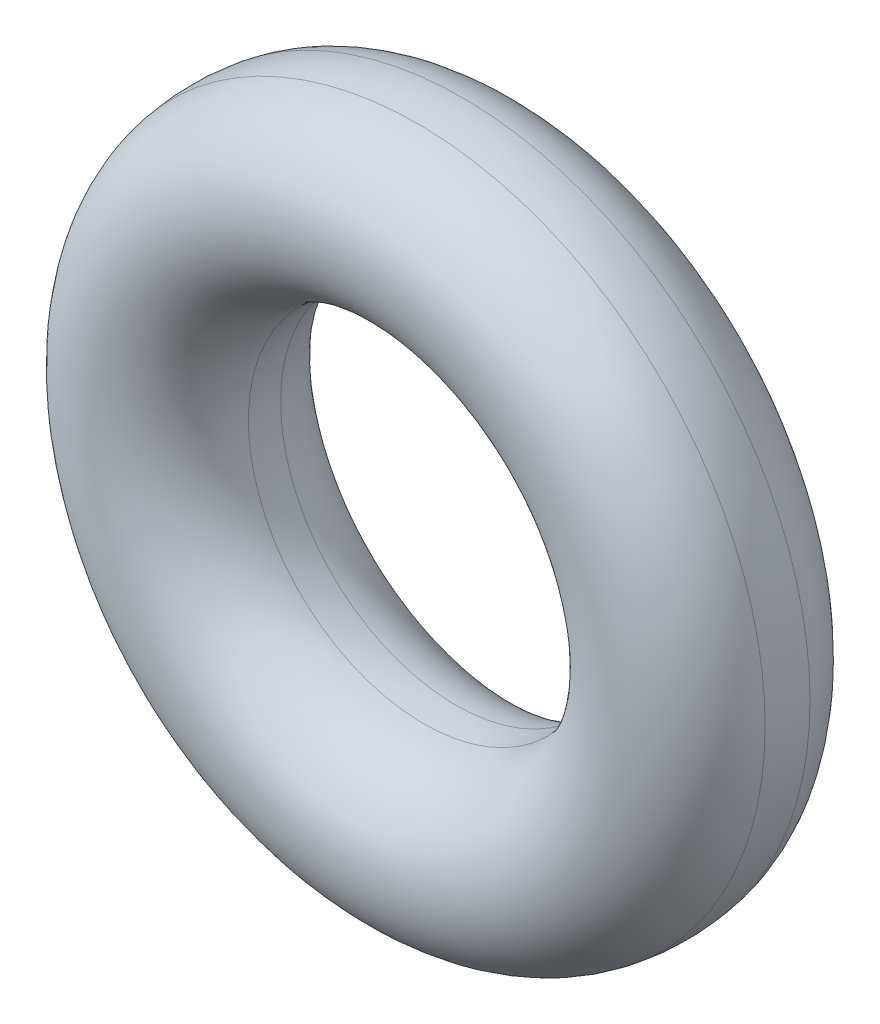
ISO-10303-21;
HEADER;
FILE_DESCRIPTION(('STEP AP214'),'2;1');
FILE_NAME('part.step','',(''),(''),'','','');
FILE_SCHEMA(('AUTOMOTIVE_DESIGN { 1 0 10303 214 1 1 1 1 }'));
ENDSEC;
DATA;
#1=APPLICATION_CONTEXT('core data for automotive mechanical design processes');
#2=APPLICATION_PROTOCOL_DEFINITION('international standard','automotive_design',2000,#1);
#3=PRODUCT_CONTEXT('',#1,'mechanical');
#4=PRODUCT('Part','Part','',(#3));
#5=PRODUCT_RELATED_PRODUCT_CATEGORY('part','',(#4));
#6=PRODUCT_DEFINITION_FORMATION('','',#4);
#7=PRODUCT_DEFINITION_CONTEXT('part definition',#1,'design');
#8=PRODUCT_DEFINITION('design','',#6,#7);
#9=PRODUCT_DEFINITION_SHAPE('','',#8);
#10=(LENGTH_UNIT() NAMED_UNIT(*) SI_UNIT(.MILLI.,.METRE.));
#11=(NAMED_UNIT(*) PLANE_ANGLE_UNIT() SI_UNIT($,.RADIAN.));
#12=(NAMED_UNIT(*) SI_UNIT($,.STERADIAN.) SOLID_ANGLE_UNIT());
#13=UNCERTAINTY_MEASURE_WITH_UNIT(LENGTH_MEASURE(1.E-05),#10,'distance_accuracy_value','');
#14=(GEOMETRIC_REPRESENTATION_CONTEXT(3) GLOBAL_UNCERTAINTY_ASSIGNED_CONTEXT((#13)) GLOBAL_UNIT_ASSIGNED_CONTEXT((#10,
#11,#12)) REPRESENTATION_CONTEXT('',''));
#15=CARTESIAN_POINT('',(0.,0.,0.));
#16=DIRECTION('',(0.,0.,1.));
#17=DIRECTION('',(1.,0.,0.));
#18=AXIS2_PLACEMENT_3D('',#15,#16,#17);
#19=CARTESIAN_POINT('',(0.,0.,0.));
#20=DIRECTION('',(0.,0.,1.));
#21=DIRECTION('',(1.,0.,0.));
#22=AXIS2_PLACEMENT_3D('',#19,#20,#21);
#23=TOROIDAL_SURFACE('',#22,102.645179781245,53.8995653079708);
#24=CARTESIAN_POINT('',(0.,0.,-4.49019852105267));
#25=DIRECTION('',(0.,0.,1.));
#26=DIRECTION('',(1.,0.,0.));
#27=AXIS2_PLACEMENT_3D('',#24,#25,#26);
#28=CIRCLE('',#27,48.9329720661478);
#29=CARTESIAN_POINT('',(48.9329720661478,0.,-4.49019852105267));
#30=VERTEX_POINT('',#29);
#31=EDGE_CURVE('E10',#30,#30,#28,.T.);
#32=ORIENTED_EDGE('',*,*,#31,.F.);
#33=EDGE_LOOP('',(#32));
#34=FACE_BOUND('',#33,.T.);
#35=CARTESIAN_POINT('',(0.,0.,4.49019852105267));
#36=DIRECTION('',(0.,0.,1.));
#37=DIRECTION('',(1.,0.,0.));
#38=AXIS2_PLACEMENT_3D('',#35,#36,#37);
#39=CIRCLE('',#38,48.9329720661478);
#40=CARTESIAN_POINT('',(48.9329720661478,0.,4.49019852105267));
#41=VERTEX_POINT('',#40);
#42=EDGE_CURVE('E51',#41,#41,#39,.T.);
#43=ORIENTED_EDGE('',*,*,#42,.T.);
#44=EDGE_LOOP('',(#43));
#45=FACE_BOUND('',#44,.T.);
#46=ADVANCED_FACE('F36',(#34,#45),#23,.T.);
#47=CARTESIAN_POINT('',(0.,0.,-2.47182783065866));
#48=DIRECTION('',(0.,0.,1.));
#49=DIRECTION('',(1.,0.,0.));
#50=AXIS2_PLACEMENT_3D('',#47,#48,#49);
#51=TOROIDAL_SURFACE('',#50,73.0769258936261,24.2281721693414);
#52=CARTESIAN_POINT('',(0.,0.,-6.26896985485401));
#53=DIRECTION('',(0.,0.,1.));
#54=DIRECTION('',(1.,0.,0.));
#55=AXIS2_PLACEMENT_3D('',#52,#53,#54);
#56=CIRCLE('',#55,97.005696006512);
#57=CARTESIAN_POINT('',(97.005696006512,0.,-6.26896985485401));
#58=VERTEX_POINT('',#57);
#59=EDGE_CURVE('E43',#58,#58,#56,.T.);
#60=ORIENTED_EDGE('',*,*,#59,.F.);
#61=EDGE_LOOP('',(#60));
#62=FACE_BOUND('',#61,.T.);
#63=ORIENTED_EDGE('',*,*,#31,.T.);
#64=EDGE_LOOP('',(#63));
#65=FACE_BOUND('',#64,.T.);
#66=ADVANCED_FACE('F99',(#62,#65),#51,.T.);
#67=CARTESIAN_POINT('',(0.,0.,0.));
#68=DIRECTION('',(0.,0.,1.));
#69=DIRECTION('',(1.,0.,0.));
#70=AXIS2_PLACEMENT_3D('',#67,#68,#69);
#71=TOROIDAL_SURFACE('',#70,57.5,40.);
#72=CARTESIAN_POINT('',(0.,0.,6.268969854854));
#73=DIRECTION('',(0.,0.,1.));
#74=DIRECTION('',(1.,0.,0.));
#75=AXIS2_PLACEMENT_3D('',#72,#73,#74);
#76=CIRCLE('',#75,97.0056960065119);
#77=CARTESIAN_POINT('',(97.0056960065119,0.,6.268969854854));
#78=VERTEX_POINT('',#77);
#79=EDGE_CURVE('E47',#78,#78,#76,.T.);
#80=ORIENTED_EDGE('',*,*,#79,.F.);
#81=EDGE_LOOP('',(#80));
#82=FACE_BOUND('',#81,.T.);
#83=ORIENTED_EDGE('',*,*,#59,.T.);
#84=EDGE_LOOP('',(#83));
#85=FACE_BOUND('',#84,.T.);
#86=ADVANCED_FACE('F96',(#82,#85),#71,.T.);
#87=CARTESIAN_POINT('',(0.,0.,2.47182783065866));
#88=DIRECTION('',(0.,0.,1.));
#89=DIRECTION('',(1.,0.,0.));
#90=AXIS2_PLACEMENT_3D('',#87,#88,#89);
#91=TOROIDAL_SURFACE('',#90,73.0769258936261,24.2281721693413);
#92=ORIENTED_EDGE('',*,*,#42,.F.);
#93=EDGE_LOOP('',(#92));
#94=FACE_BOUND('',#93,.T.);
#95=ORIENTED_EDGE('',*,*,#79,.T.);
#96=EDGE_LOOP('',(#95));
#97=FACE_BOUND('',#96,.T.);
#98=ADVANCED_FACE('F94',(#94,#97),#91,.T.);
#99=CLOSED_SHELL('',(#46,#66,#86,#98));
#100=CARTESIAN_POINT('',(0.,0.,0.));
#101=DIRECTION('',(0.,0.,1.));
#102=DIRECTION('',(1.,0.,0.));
#103=AXIS2_PLACEMENT_3D('',#100,#101,#102);
#104=TOROIDAL_SURFACE('',#103,57.5,36.825);
#105=CARTESIAN_POINT('',(0.,0.,5.77137037262494));
#106=DIRECTION('',(0.,0.,1.));
#107=DIRECTION('',(1.,0.,0.));
#108=AXIS2_PLACEMENT_3D('',#105,#106,#107);
#109=CIRCLE('',#108,93.8699313859951);
#110=CARTESIAN_POINT('',(93.8699313859951,0.,5.77137037262494));
#111=VERTEX_POINT('',#110);
#112=EDGE_CURVE('E56',#111,#111,#109,.T.);
#113=ORIENTED_EDGE('',*,*,#112,.T.);
#114=EDGE_LOOP('',(#113));
#115=FACE_BOUND('',#114,.T.);
#116=CARTESIAN_POINT('',(0.,0.,-5.77137037262494));
#117=DIRECTION('',(0.,0.,1.));
#118=DIRECTION('',(1.,0.,0.));
#119=AXIS2_PLACEMENT_3D('',#116,#117,#118);
#120=CIRCLE('',#119,93.8699313859951);
#121=CARTESIAN_POINT('',(93.8699313859951,0.,-5.77137037262494));
#122=VERTEX_POINT('',#121);
#123=EDGE_CURVE('E59',#122,#122,#120,.T.);
#124=ORIENTED_EDGE('',*,*,#123,.F.);
#125=EDGE_LOOP('',(#124));
#126=FACE_BOUND('',#125,.T.);
#127=ADVANCED_FACE('F83',(#115,#126),#104,.F.);
#128=CARTESIAN_POINT('',(0.,0.,-2.47182783065866));
#129=DIRECTION('',(0.,0.,1.));
#130=DIRECTION('',(1.,0.,0.));
#131=AXIS2_PLACEMENT_3D('',#128,#129,#130);
#132=TOROIDAL_SURFACE('',#131,73.0769258936261,21.0531721693413);
#133=ORIENTED_EDGE('',*,*,#123,.T.);
#134=EDGE_LOOP('',(#133));
#135=FACE_BOUND('',#134,.T.);
#136=CARTESIAN_POINT('',(0.,0.,-4.2256995362671));
#137=DIRECTION('',(0.,0.,1.));
#138=DIRECTION('',(1.,0.,0.));
#139=AXIS2_PLACEMENT_3D('',#136,#137,#138);
#140=CIRCLE('',#139,52.0969356068745);
#141=CARTESIAN_POINT('',(52.0969356068745,0.,-4.2256995362671));
#142=VERTEX_POINT('',#141);
#143=EDGE_CURVE('E62',#142,#142,#140,.T.);
#144=ORIENTED_EDGE('',*,*,#143,.F.);
#145=EDGE_LOOP('',(#144));
#146=FACE_BOUND('',#145,.T.);
#147=ADVANCED_FACE('F74',(#135,#146),#132,.F.);
#148=CARTESIAN_POINT('',(0.,0.,0.));
#149=DIRECTION('',(0.,0.,1.));
#150=DIRECTION('',(1.,0.,0.));
#151=AXIS2_PLACEMENT_3D('',#148,#149,#150);
#152=TOROIDAL_SURFACE('',#151,102.645179781245,50.7245653079708);
#153=ORIENTED_EDGE('',*,*,#143,.T.);
#154=EDGE_LOOP('',(#153));
#155=FACE_BOUND('',#154,.T.);
#156=CARTESIAN_POINT('',(0.,0.,4.22569953626709));
#157=DIRECTION('',(0.,0.,1.));
#158=DIRECTION('',(1.,0.,0.));
#159=AXIS2_PLACEMENT_3D('',#156,#157,#158);
#160=CIRCLE('',#159,52.0969356068745);
#161=CARTESIAN_POINT('',(52.0969356068745,0.,4.22569953626709));
#162=VERTEX_POINT('',#161);
#163=EDGE_CURVE('E65',#162,#162,#160,.T.);
#164=ORIENTED_EDGE('',*,*,#163,.F.);
#165=EDGE_LOOP('',(#164));
#166=FACE_BOUND('',#165,.T.);
#167=ADVANCED_FACE('F72',(#155,#166),#152,.F.);
#168=CARTESIAN_POINT('',(0.,0.,2.47182783065866));
#169=DIRECTION('',(0.,0.,1.));
#170=DIRECTION('',(1.,0.,0.));
#171=AXIS2_PLACEMENT_3D('',#168,#169,#170);
#172=TOROIDAL_SURFACE('',#171,73.0769258936261,21.0531721693413);
#173=ORIENTED_EDGE('',*,*,#163,.T.);
#174=EDGE_LOOP('',(#173));
#175=FACE_BOUND('',#174,.T.);
#176=ORIENTED_EDGE('',*,*,#112,.F.);
#177=EDGE_LOOP('',(#176));
#178=FACE_BOUND('',#177,.T.);
#179=ADVANCED_FACE('F69',(#175,#178),#172,.F.);
#180=CLOSED_SHELL('',(#127,#147,#167,#179));
#181=ORIENTED_CLOSED_SHELL('',*,#180,.T.);
#182=BREP_WITH_VOIDS('B2',#99,(#181));
#183=ADVANCED_BREP_SHAPE_REPRESENTATION('',(#18,#182),#14);
#184=SHAPE_DEFINITION_REPRESENTATION(#9,#183);
ENDSEC;
END-ISO-10303-21;
